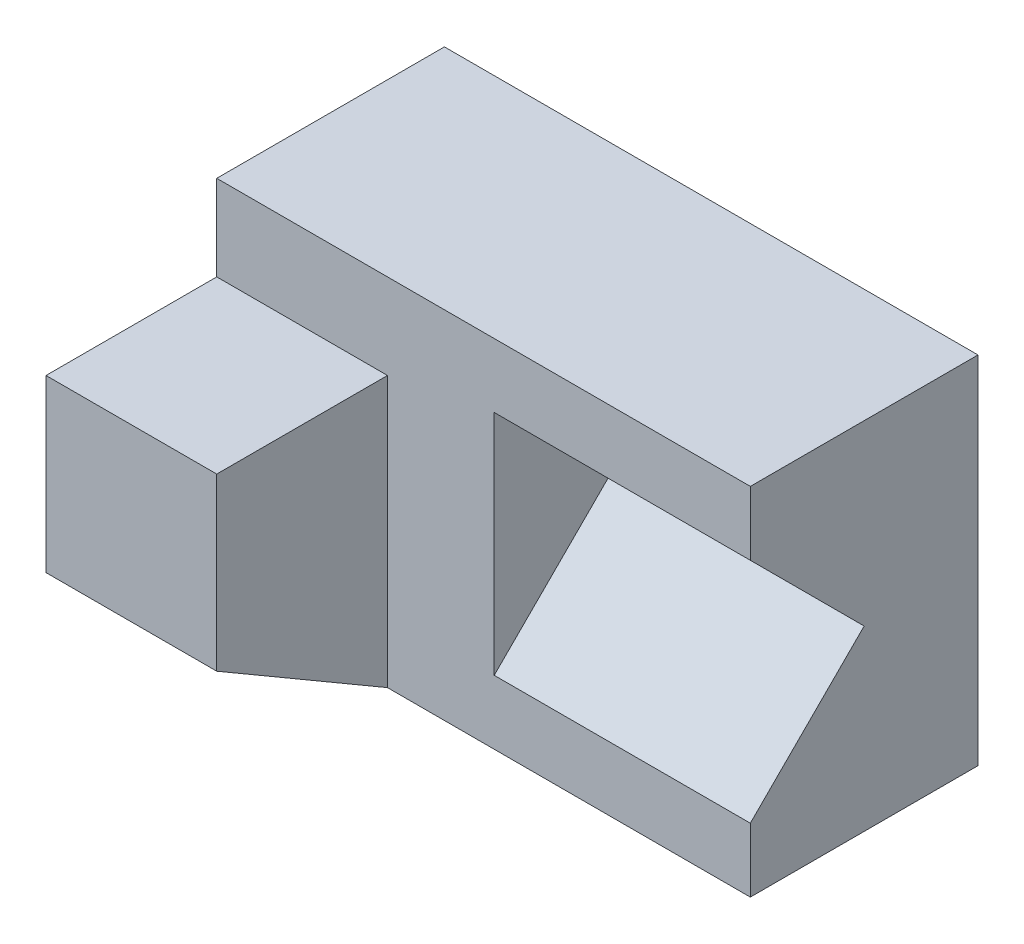
ISO-10303-21;
HEADER;
FILE_DESCRIPTION(('STEP AP214'),'2;1');
FILE_NAME('part.step','',(''),(''),'','','');
FILE_SCHEMA(('AUTOMOTIVE_DESIGN { 1 0 10303 214 1 1 1 1 }'));
ENDSEC;
DATA;
#1=APPLICATION_CONTEXT('core data for automotive mechanical design processes');
#2=APPLICATION_PROTOCOL_DEFINITION('international standard','automotive_design',2000,#1);
#3=PRODUCT_CONTEXT('',#1,'mechanical');
#4=PRODUCT('Part','Part','',(#3));
#5=PRODUCT_RELATED_PRODUCT_CATEGORY('part','',(#4));
#6=PRODUCT_DEFINITION_FORMATION('','',#4);
#7=PRODUCT_DEFINITION_CONTEXT('part definition',#1,'design');
#8=PRODUCT_DEFINITION('design','',#6,#7);
#9=PRODUCT_DEFINITION_SHAPE('','',#8);
#10=(LENGTH_UNIT() NAMED_UNIT(*) SI_UNIT(.MILLI.,.METRE.));
#11=(NAMED_UNIT(*) PLANE_ANGLE_UNIT() SI_UNIT($,.RADIAN.));
#12=(NAMED_UNIT(*) SI_UNIT($,.STERADIAN.) SOLID_ANGLE_UNIT());
#13=UNCERTAINTY_MEASURE_WITH_UNIT(LENGTH_MEASURE(1.E-05),#10,'distance_accuracy_value','');
#14=(GEOMETRIC_REPRESENTATION_CONTEXT(3) GLOBAL_UNCERTAINTY_ASSIGNED_CONTEXT((#13)) GLOBAL_UNIT_ASSIGNED_CONTEXT((#10,
#11,#12)) REPRESENTATION_CONTEXT('',''));
#15=CARTESIAN_POINT('',(0.,0.,0.));
#16=DIRECTION('',(0.,0.,1.));
#17=DIRECTION('',(1.,0.,0.));
#18=AXIS2_PLACEMENT_3D('',#15,#16,#17);
#19=CARTESIAN_POINT('',(0.,0.,32.));
#20=DIRECTION('',(0.,0.,-1.));
#21=DIRECTION('',(-1.,0.,0.));
#22=AXIS2_PLACEMENT_3D('',#19,#20,#21);
#23=PLANE('',#22);
#24=DIRECTION('',(-1.,0.,0.));
#25=VECTOR('',#24,1.);
#26=CARTESIAN_POINT('',(24.,38.,32.));
#27=LINE('',#26,#25);
#28=CARTESIAN_POINT('',(24.,38.,32.));
#29=VERTEX_POINT('',#28);
#30=CARTESIAN_POINT('',(0.,38.,32.));
#31=VERTEX_POINT('',#30);
#32=EDGE_CURVE('E131',#29,#31,#27,.T.);
#33=ORIENTED_EDGE('',*,*,#32,.F.);
#34=DIRECTION('',(0.,-1.,0.));
#35=VECTOR('',#34,1.);
#36=CARTESIAN_POINT('',(24.,38.,32.));
#37=LINE('',#36,#35);
#38=CARTESIAN_POINT('',(24.,0.,32.));
#39=VERTEX_POINT('',#38);
#40=EDGE_CURVE('E136',#29,#39,#37,.T.);
#41=ORIENTED_EDGE('',*,*,#40,.T.);
#42=DIRECTION('',(1.,0.,0.));
#43=VECTOR('',#42,1.);
#44=CARTESIAN_POINT('',(0.,0.,32.));
#45=LINE('',#44,#43);
#46=CARTESIAN_POINT('',(75.,0.,32.));
#47=VERTEX_POINT('',#46);
#48=EDGE_CURVE('E173',#39,#47,#45,.T.);
#49=ORIENTED_EDGE('',*,*,#48,.T.);
#50=DIRECTION('',(0.,1.,0.));
#51=VECTOR('',#50,1.);
#52=CARTESIAN_POINT('',(75.,0.,32.));
#53=LINE('',#52,#51);
#54=CARTESIAN_POINT('',(75.,9.,32.));
#55=VERTEX_POINT('',#54);
#56=EDGE_CURVE('E178',#47,#55,#53,.T.);
#57=ORIENTED_EDGE('',*,*,#56,.T.);
#58=DIRECTION('',(1.,0.,0.));
#59=VECTOR('',#58,1.);
#60=CARTESIAN_POINT('',(39.,9.,32.));
#61=LINE('',#60,#59);
#62=CARTESIAN_POINT('',(39.,9.,32.));
#63=VERTEX_POINT('',#62);
#64=EDGE_CURVE('E159',#63,#55,#61,.T.);
#65=ORIENTED_EDGE('',*,*,#64,.F.);
#66=DIRECTION('',(0.,-1.,0.));
#67=VECTOR('',#66,1.);
#68=CARTESIAN_POINT('',(39.,41.,32.));
#69=LINE('',#68,#67);
#70=CARTESIAN_POINT('',(39.,41.,32.));
#71=VERTEX_POINT('',#70);
#72=EDGE_CURVE('E153',#71,#63,#69,.T.);
#73=ORIENTED_EDGE('',*,*,#72,.F.);
#74=DIRECTION('',(1.,0.,0.));
#75=VECTOR('',#74,1.);
#76=CARTESIAN_POINT('',(39.,41.,32.));
#77=LINE('',#76,#75);
#78=CARTESIAN_POINT('',(75.,41.,32.));
#79=VERTEX_POINT('',#78);
#80=EDGE_CURVE('E163',#71,#79,#77,.T.);
#81=ORIENTED_EDGE('',*,*,#80,.T.);
#82=CARTESIAN_POINT('',(75.,50.,32.));
#83=VERTEX_POINT('',#82);
#84=EDGE_CURVE('E177',#79,#83,#53,.T.);
#85=ORIENTED_EDGE('',*,*,#84,.T.);
#86=DIRECTION('',(-1.,0.,0.));
#87=VECTOR('',#86,1.);
#88=CARTESIAN_POINT('',(0.,50.,32.));
#89=LINE('',#88,#87);
#90=CARTESIAN_POINT('',(0.,50.,32.));
#91=VERTEX_POINT('',#90);
#92=EDGE_CURVE('E181',#83,#91,#89,.T.);
#93=ORIENTED_EDGE('',*,*,#92,.T.);
#94=DIRECTION('',(0.,-1.,0.));
#95=VECTOR('',#94,1.);
#96=CARTESIAN_POINT('',(0.,0.,32.));
#97=LINE('',#96,#95);
#98=EDGE_CURVE('E170',#91,#31,#97,.T.);
#99=ORIENTED_EDGE('',*,*,#98,.T.);
#100=EDGE_LOOP('',(#33,#41,#49,#57,#65,#73,#81,#85,#93,#99));
#101=FACE_BOUND('',#100,.T.);
#102=ADVANCED_FACE('F37',(#101),#23,.F.);
#103=CARTESIAN_POINT('',(0.,0.,32.));
#104=DIRECTION('',(1.,0.,0.));
#105=DIRECTION('',(0.,0.,-1.));
#106=AXIS2_PLACEMENT_3D('',#103,#104,#105);
#107=PLANE('',#106);
#108=DIRECTION('',(0.,-1.,0.));
#109=VECTOR('',#108,1.);
#110=CARTESIAN_POINT('',(0.,0.,0.));
#111=LINE('',#110,#109);
#112=CARTESIAN_POINT('',(0.,50.,0.));
#113=VERTEX_POINT('',#112);
#114=CARTESIAN_POINT('',(0.,0.,0.));
#115=VERTEX_POINT('',#114);
#116=EDGE_CURVE('E166',#113,#115,#111,.T.);
#117=ORIENTED_EDGE('',*,*,#116,.T.);
#118=DIRECTION('',(0.,0.,-1.));
#119=VECTOR('',#118,1.);
#120=CARTESIAN_POINT('',(0.,0.,32.));
#121=LINE('',#120,#119);
#122=CARTESIAN_POINT('',(0.,0.,32.));
#123=VERTEX_POINT('',#122);
#124=EDGE_CURVE('E11',#123,#115,#121,.T.);
#125=ORIENTED_EDGE('',*,*,#124,.F.);
#126=DIRECTION('',(0.,0.503871025524086,0.863778900898433));
#127=VECTOR('',#126,1.);
#128=CARTESIAN_POINT('',(0.,0.,32.));
#129=LINE('',#128,#127);
#130=CARTESIAN_POINT('',(0.,14.,56.));
#131=VERTEX_POINT('',#130);
#132=EDGE_CURVE('E140',#123,#131,#129,.T.);
#133=ORIENTED_EDGE('',*,*,#132,.T.);
#134=DIRECTION('',(0.,1.,0.));
#135=VECTOR('',#134,1.);
#136=CARTESIAN_POINT('',(0.,14.,56.));
#137=LINE('',#136,#135);
#138=CARTESIAN_POINT('',(0.,38.,56.));
#139=VERTEX_POINT('',#138);
#140=EDGE_CURVE('E147',#131,#139,#137,.T.);
#141=ORIENTED_EDGE('',*,*,#140,.T.);
#142=DIRECTION('',(0.,0.,-1.));
#143=VECTOR('',#142,1.);
#144=CARTESIAN_POINT('',(0.,38.,56.));
#145=LINE('',#144,#143);
#146=EDGE_CURVE('E126',#139,#31,#145,.T.);
#147=ORIENTED_EDGE('',*,*,#146,.T.);
#148=ORIENTED_EDGE('',*,*,#98,.F.);
#149=DIRECTION('',(0.,0.,-1.));
#150=VECTOR('',#149,1.);
#151=CARTESIAN_POINT('',(0.,50.,32.));
#152=LINE('',#151,#150);
#153=EDGE_CURVE('E183',#91,#113,#152,.T.);
#154=ORIENTED_EDGE('',*,*,#153,.T.);
#155=EDGE_LOOP('',(#117,#125,#133,#141,#147,#148,#154));
#156=FACE_BOUND('',#155,.T.);
#157=ADVANCED_FACE('F39',(#156),#107,.F.);
#158=CARTESIAN_POINT('',(0.,0.,32.));
#159=DIRECTION('',(0.,1.,0.));
#160=DIRECTION('',(0.,0.,1.));
#161=AXIS2_PLACEMENT_3D('',#158,#159,#160);
#162=PLANE('',#161);
#163=DIRECTION('',(1.,0.,0.));
#164=VECTOR('',#163,1.);
#165=CARTESIAN_POINT('',(0.,0.,0.));
#166=LINE('',#165,#164);
#167=CARTESIAN_POINT('',(75.,0.,0.));
#168=VERTEX_POINT('',#167);
#169=EDGE_CURVE('E186',#115,#168,#166,.T.);
#170=ORIENTED_EDGE('',*,*,#169,.T.);
#171=DIRECTION('',(0.,0.,-1.));
#172=VECTOR('',#171,1.);
#173=CARTESIAN_POINT('',(75.,0.,32.));
#174=LINE('',#173,#172);
#175=EDGE_CURVE('E45',#47,#168,#174,.T.);
#176=ORIENTED_EDGE('',*,*,#175,.F.);
#177=ORIENTED_EDGE('',*,*,#48,.F.);
#178=EDGE_CURVE('E175',#123,#39,#45,.T.);
#179=ORIENTED_EDGE('',*,*,#178,.F.);
#180=ORIENTED_EDGE('',*,*,#124,.T.);
#181=EDGE_LOOP('',(#170,#176,#177,#179,#180));
#182=FACE_BOUND('',#181,.T.);
#183=ADVANCED_FACE('F226',(#182),#162,.F.);
#184=CARTESIAN_POINT('',(75.,0.,32.));
#185=DIRECTION('',(-1.,0.,0.));
#186=DIRECTION('',(0.,0.,1.));
#187=AXIS2_PLACEMENT_3D('',#184,#185,#186);
#188=PLANE('',#187);
#189=ORIENTED_EDGE('',*,*,#84,.F.);
#190=DIRECTION('',(0.,0.707106781186548,0.707106781186548));
#191=VECTOR('',#190,1.);
#192=CARTESIAN_POINT('',(75.,41.,32.));
#193=LINE('',#192,#191);
#194=CARTESIAN_POINT('',(75.,25.,16.));
#195=VERTEX_POINT('',#194);
#196=EDGE_CURVE('E156',#195,#79,#193,.T.);
#197=ORIENTED_EDGE('',*,*,#196,.F.);
#198=DIRECTION('',(0.,0.707106781186548,-0.707106781186548));
#199=VECTOR('',#198,1.);
#200=CARTESIAN_POINT('',(75.,25.,16.));
#201=LINE('',#200,#199);
#202=EDGE_CURVE('E151',#55,#195,#201,.T.);
#203=ORIENTED_EDGE('',*,*,#202,.F.);
#204=ORIENTED_EDGE('',*,*,#56,.F.);
#205=ORIENTED_EDGE('',*,*,#175,.T.);
#206=DIRECTION('',(0.,1.,0.));
#207=VECTOR('',#206,1.);
#208=CARTESIAN_POINT('',(75.,0.,0.));
#209=LINE('',#208,#207);
#210=CARTESIAN_POINT('',(75.,50.,0.));
#211=VERTEX_POINT('',#210);
#212=EDGE_CURVE('E188',#168,#211,#209,.T.);
#213=ORIENTED_EDGE('',*,*,#212,.T.);
#214=DIRECTION('',(0.,0.,-1.));
#215=VECTOR('',#214,1.);
#216=CARTESIAN_POINT('',(75.,50.,32.));
#217=LINE('',#216,#215);
#218=EDGE_CURVE('E193',#83,#211,#217,.T.);
#219=ORIENTED_EDGE('',*,*,#218,.F.);
#220=EDGE_LOOP('',(#189,#197,#203,#204,#205,#213,#219));
#221=FACE_BOUND('',#220,.T.);
#222=ADVANCED_FACE('F201',(#221),#188,.F.);
#223=CARTESIAN_POINT('',(0.,50.,32.));
#224=DIRECTION('',(0.,-1.,0.));
#225=DIRECTION('',(0.,0.,-1.));
#226=AXIS2_PLACEMENT_3D('',#223,#224,#225);
#227=PLANE('',#226);
#228=DIRECTION('',(-1.,0.,0.));
#229=VECTOR('',#228,1.);
#230=CARTESIAN_POINT('',(0.,50.,0.));
#231=LINE('',#230,#229);
#232=EDGE_CURVE('E174',#211,#113,#231,.T.);
#233=ORIENTED_EDGE('',*,*,#232,.T.);
#234=ORIENTED_EDGE('',*,*,#153,.F.);
#235=ORIENTED_EDGE('',*,*,#92,.F.);
#236=ORIENTED_EDGE('',*,*,#218,.T.);
#237=EDGE_LOOP('',(#233,#234,#235,#236));
#238=FACE_BOUND('',#237,.T.);
#239=ADVANCED_FACE('F212',(#238),#227,.F.);
#240=CARTESIAN_POINT('',(0.,0.,0.));
#241=DIRECTION('',(0.,0.,-1.));
#242=DIRECTION('',(-1.,0.,0.));
#243=AXIS2_PLACEMENT_3D('',#240,#241,#242);
#244=PLANE('',#243);
#245=ORIENTED_EDGE('',*,*,#116,.F.);
#246=ORIENTED_EDGE('',*,*,#232,.F.);
#247=ORIENTED_EDGE('',*,*,#212,.F.);
#248=ORIENTED_EDGE('',*,*,#169,.F.);
#249=EDGE_LOOP('',(#245,#246,#247,#248));
#250=FACE_BOUND('',#249,.T.);
#251=ADVANCED_FACE('F209',(#250),#244,.T.);
#252=CARTESIAN_POINT('',(39.,41.,32.));
#253=DIRECTION('',(0.,0.707106781186547,-0.707106781186547));
#254=DIRECTION('',(0.,0.707106781186548,0.707106781186548));
#255=AXIS2_PLACEMENT_3D('',#252,#253,#254);
#256=PLANE('',#255);
#257=ORIENTED_EDGE('',*,*,#196,.T.);
#258=ORIENTED_EDGE('',*,*,#80,.F.);
#259=DIRECTION('',(0.,0.707106781186548,0.707106781186548));
#260=VECTOR('',#259,1.);
#261=CARTESIAN_POINT('',(39.,41.,32.));
#262=LINE('',#261,#260);
#263=CARTESIAN_POINT('',(39.,25.,16.));
#264=VERTEX_POINT('',#263);
#265=EDGE_CURVE('E60',#264,#71,#262,.T.);
#266=ORIENTED_EDGE('',*,*,#265,.F.);
#267=DIRECTION('',(1.,0.,0.));
#268=VECTOR('',#267,1.);
#269=CARTESIAN_POINT('',(39.,25.,16.));
#270=LINE('',#269,#268);
#271=EDGE_CURVE('E167',#264,#195,#270,.T.);
#272=ORIENTED_EDGE('',*,*,#271,.T.);
#273=EDGE_LOOP('',(#257,#258,#266,#272));
#274=FACE_BOUND('',#273,.T.);
#275=ADVANCED_FACE('F221',(#274),#256,.F.);
#276=CARTESIAN_POINT('',(39.,25.,16.));
#277=DIRECTION('',(0.,-0.707106781186547,-0.707106781186547));
#278=DIRECTION('',(0.,0.707106781186548,-0.707106781186548));
#279=AXIS2_PLACEMENT_3D('',#276,#277,#278);
#280=PLANE('',#279);
#281=ORIENTED_EDGE('',*,*,#202,.T.);
#282=ORIENTED_EDGE('',*,*,#271,.F.);
#283=DIRECTION('',(0.,0.707106781186548,-0.707106781186548));
#284=VECTOR('',#283,1.);
#285=CARTESIAN_POINT('',(39.,25.,16.));
#286=LINE('',#285,#284);
#287=EDGE_CURVE('E155',#63,#264,#286,.T.);
#288=ORIENTED_EDGE('',*,*,#287,.F.);
#289=ORIENTED_EDGE('',*,*,#64,.T.);
#290=EDGE_LOOP('',(#281,#282,#288,#289));
#291=FACE_BOUND('',#290,.T.);
#292=ADVANCED_FACE('F223',(#291),#280,.F.);
#293=CARTESIAN_POINT('',(39.,0.,0.));
#294=DIRECTION('',(-1.,0.,0.));
#295=DIRECTION('',(0.,0.,1.));
#296=AXIS2_PLACEMENT_3D('',#293,#294,#295);
#297=PLANE('',#296);
#298=ORIENTED_EDGE('',*,*,#72,.T.);
#299=ORIENTED_EDGE('',*,*,#287,.T.);
#300=ORIENTED_EDGE('',*,*,#265,.T.);
#301=EDGE_LOOP('',(#298,#299,#300));
#302=FACE_BOUND('',#301,.T.);
#303=ADVANCED_FACE('F236',(#302),#297,.F.);
#304=CARTESIAN_POINT('',(24.,14.,56.));
#305=DIRECTION('',(0.,0.,1.));
#306=DIRECTION('',(0.,-1.,0.));
#307=AXIS2_PLACEMENT_3D('',#304,#305,#306);
#308=PLANE('',#307);
#309=ORIENTED_EDGE('',*,*,#140,.F.);
#310=DIRECTION('',(-1.,0.,0.));
#311=VECTOR('',#310,1.);
#312=CARTESIAN_POINT('',(24.,14.,56.));
#313=LINE('',#312,#311);
#314=CARTESIAN_POINT('',(24.,14.,56.));
#315=VERTEX_POINT('',#314);
#316=EDGE_CURVE('E139',#315,#131,#313,.T.);
#317=ORIENTED_EDGE('',*,*,#316,.F.);
#318=DIRECTION('',(0.,1.,0.));
#319=VECTOR('',#318,1.);
#320=CARTESIAN_POINT('',(24.,14.,56.));
#321=LINE('',#320,#319);
#322=CARTESIAN_POINT('',(24.,38.,56.));
#323=VERTEX_POINT('',#322);
#324=EDGE_CURVE('E134',#315,#323,#321,.T.);
#325=ORIENTED_EDGE('',*,*,#324,.T.);
#326=DIRECTION('',(-1.,0.,0.));
#327=VECTOR('',#326,1.);
#328=CARTESIAN_POINT('',(24.,38.,56.));
#329=LINE('',#328,#327);
#330=EDGE_CURVE('E120',#323,#139,#329,.T.);
#331=ORIENTED_EDGE('',*,*,#330,.T.);
#332=EDGE_LOOP('',(#309,#317,#325,#331));
#333=FACE_BOUND('',#332,.T.);
#334=ADVANCED_FACE('F138',(#333),#308,.T.);
#335=CARTESIAN_POINT('',(24.,0.,32.));
#336=DIRECTION('',(0.,-0.863778900898433,0.503871025524086));
#337=DIRECTION('',(0.,-0.503871025524086,-0.863778900898433));
#338=AXIS2_PLACEMENT_3D('',#335,#336,#337);
#339=PLANE('',#338);
#340=ORIENTED_EDGE('',*,*,#132,.F.);
#341=ORIENTED_EDGE('',*,*,#178,.T.);
#342=DIRECTION('',(0.,0.503871025524086,0.863778900898433));
#343=VECTOR('',#342,1.);
#344=CARTESIAN_POINT('',(24.,0.,32.));
#345=LINE('',#344,#343);
#346=EDGE_CURVE('E52',#39,#315,#345,.T.);
#347=ORIENTED_EDGE('',*,*,#346,.T.);
#348=ORIENTED_EDGE('',*,*,#316,.T.);
#349=EDGE_LOOP('',(#340,#341,#347,#348));
#350=FACE_BOUND('',#349,.T.);
#351=ADVANCED_FACE('F228',(#350),#339,.T.);
#352=CARTESIAN_POINT('',(24.,38.,56.));
#353=DIRECTION('',(0.,1.,0.));
#354=DIRECTION('',(0.,0.,1.));
#355=AXIS2_PLACEMENT_3D('',#352,#353,#354);
#356=PLANE('',#355);
#357=ORIENTED_EDGE('',*,*,#146,.F.);
#358=ORIENTED_EDGE('',*,*,#330,.F.);
#359=DIRECTION('',(0.,0.,-1.));
#360=VECTOR('',#359,1.);
#361=CARTESIAN_POINT('',(24.,38.,56.));
#362=LINE('',#361,#360);
#363=EDGE_CURVE('E123',#323,#29,#362,.T.);
#364=ORIENTED_EDGE('',*,*,#363,.T.);
#365=ORIENTED_EDGE('',*,*,#32,.T.);
#366=EDGE_LOOP('',(#357,#358,#364,#365));
#367=FACE_BOUND('',#366,.T.);
#368=ADVANCED_FACE('F122',(#367),#356,.T.);
#369=CARTESIAN_POINT('',(24.,0.,0.));
#370=DIRECTION('',(-1.,0.,0.));
#371=DIRECTION('',(0.,0.,1.));
#372=AXIS2_PLACEMENT_3D('',#369,#370,#371);
#373=PLANE('',#372);
#374=ORIENTED_EDGE('',*,*,#324,.F.);
#375=ORIENTED_EDGE('',*,*,#346,.F.);
#376=ORIENTED_EDGE('',*,*,#40,.F.);
#377=ORIENTED_EDGE('',*,*,#363,.F.);
#378=EDGE_LOOP('',(#374,#375,#376,#377));
#379=FACE_BOUND('',#378,.T.);
#380=ADVANCED_FACE('F133',(#379),#373,.F.);
#381=CLOSED_SHELL('',(#102,#157,#183,#222,#239,#251,#275,#292,#303,#334,#351,#368,#380));
#382=MANIFOLD_SOLID_BREP('B2',#381);
#383=ADVANCED_BREP_SHAPE_REPRESENTATION('',(#18,#382),#14);
#384=SHAPE_DEFINITION_REPRESENTATION(#9,#383);
ENDSEC;
END-ISO-10303-21;
